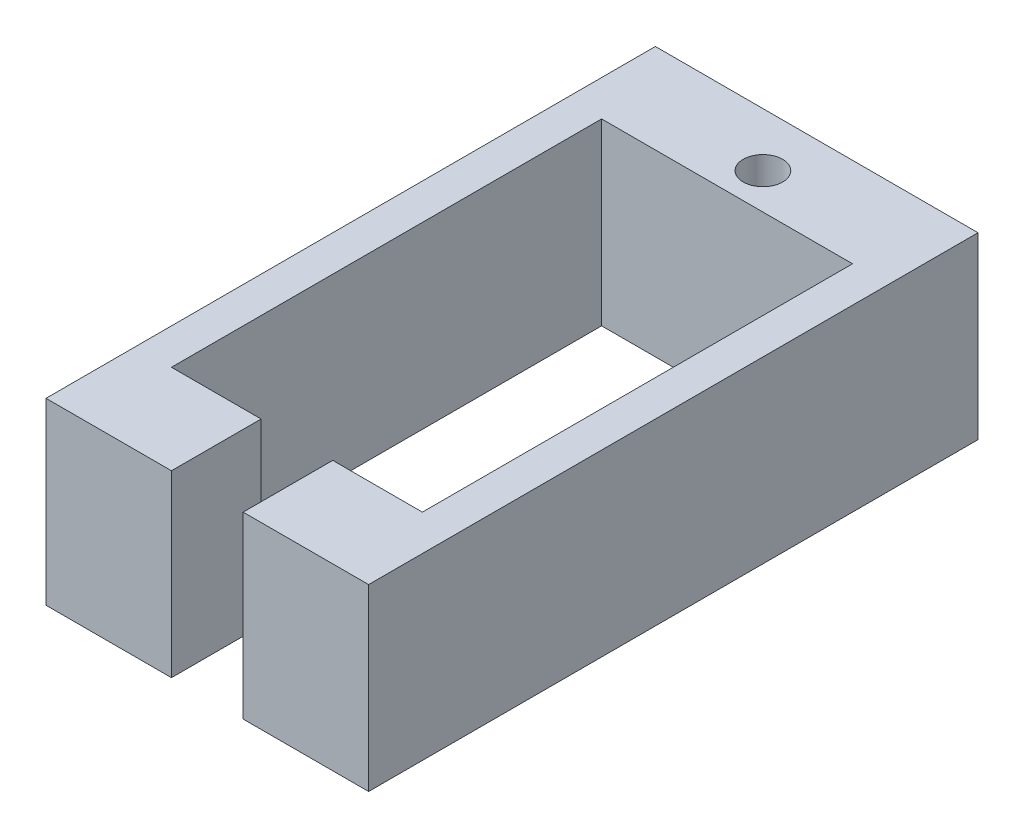
ISO-10303-21;
HEADER;
FILE_DESCRIPTION(('STEP AP214'),'2;1');
FILE_NAME('part.step','',(''),(''),'','','');
FILE_SCHEMA(('AUTOMOTIVE_DESIGN { 1 0 10303 214 1 1 1 1 }'));
ENDSEC;
DATA;
#1=APPLICATION_CONTEXT('core data for automotive mechanical design processes');
#2=APPLICATION_PROTOCOL_DEFINITION('international standard','automotive_design',2000,#1);
#3=PRODUCT_CONTEXT('',#1,'mechanical');
#4=PRODUCT('Part','Part','',(#3));
#5=PRODUCT_RELATED_PRODUCT_CATEGORY('part','',(#4));
#6=PRODUCT_DEFINITION_FORMATION('','',#4);
#7=PRODUCT_DEFINITION_CONTEXT('part definition',#1,'design');
#8=PRODUCT_DEFINITION('design','',#6,#7);
#9=PRODUCT_DEFINITION_SHAPE('','',#8);
#10=(LENGTH_UNIT() NAMED_UNIT(*) SI_UNIT(.MILLI.,.METRE.));
#11=(NAMED_UNIT(*) PLANE_ANGLE_UNIT() SI_UNIT($,.RADIAN.));
#12=(NAMED_UNIT(*) SI_UNIT($,.STERADIAN.) SOLID_ANGLE_UNIT());
#13=UNCERTAINTY_MEASURE_WITH_UNIT(LENGTH_MEASURE(1.E-05),#10,'distance_accuracy_value','');
#14=(GEOMETRIC_REPRESENTATION_CONTEXT(3) GLOBAL_UNCERTAINTY_ASSIGNED_CONTEXT((#13)) GLOBAL_UNIT_ASSIGNED_CONTEXT((#10,
#11,#12)) REPRESENTATION_CONTEXT('',''));
#15=CARTESIAN_POINT('',(0.,0.,0.));
#16=DIRECTION('',(0.,0.,1.));
#17=DIRECTION('',(1.,0.,0.));
#18=AXIS2_PLACEMENT_3D('',#15,#16,#17);
#19=CARTESIAN_POINT('',(-9.,10.,17.));
#20=DIRECTION('',(0.,0.,-1.));
#21=DIRECTION('',(-1.,0.,0.));
#22=AXIS2_PLACEMENT_3D('',#19,#20,#21);
#23=PLANE('',#22);
#24=DIRECTION('',(1.,0.,0.));
#25=VECTOR('',#24,1.);
#26=CARTESIAN_POINT('',(-9.,0.,17.));
#27=LINE('',#26,#25);
#28=CARTESIAN_POINT('',(-9.,0.,17.));
#29=VERTEX_POINT('',#28);
#30=CARTESIAN_POINT('',(-2.,0.,17.));
#31=VERTEX_POINT('',#30);
#32=EDGE_CURVE('E137',#29,#31,#27,.T.);
#33=ORIENTED_EDGE('',*,*,#32,.T.);
#34=DIRECTION('',(0.,-1.,0.));
#35=VECTOR('',#34,1.);
#36=CARTESIAN_POINT('',(-2.,0.,17.));
#37=LINE('',#36,#35);
#38=CARTESIAN_POINT('',(-2.,10.,17.));
#39=VERTEX_POINT('',#38);
#40=EDGE_CURVE('E122',#39,#31,#37,.T.);
#41=ORIENTED_EDGE('',*,*,#40,.F.);
#42=DIRECTION('',(1.,0.,0.));
#43=VECTOR('',#42,1.);
#44=CARTESIAN_POINT('',(-9.,10.,17.));
#45=LINE('',#44,#43);
#46=CARTESIAN_POINT('',(-9.,10.,17.));
#47=VERTEX_POINT('',#46);
#48=EDGE_CURVE('E158',#47,#39,#45,.T.);
#49=ORIENTED_EDGE('',*,*,#48,.F.);
#50=DIRECTION('',(0.,-1.,0.));
#51=VECTOR('',#50,1.);
#52=CARTESIAN_POINT('',(-9.,10.,17.));
#53=LINE('',#52,#51);
#54=EDGE_CURVE('E144',#47,#29,#53,.T.);
#55=ORIENTED_EDGE('',*,*,#54,.T.);
#56=EDGE_LOOP('',(#33,#41,#49,#55));
#57=FACE_BOUND('',#56,.T.);
#58=ADVANCED_FACE('F36',(#57),#23,.F.);
#59=CARTESIAN_POINT('',(-7.,10.,12.));
#60=DIRECTION('',(0.,0.,-1.));
#61=DIRECTION('',(-1.,0.,0.));
#62=AXIS2_PLACEMENT_3D('',#59,#60,#61);
#63=PLANE('',#62);
#64=DIRECTION('',(0.,1.,0.));
#65=VECTOR('',#64,1.);
#66=CARTESIAN_POINT('',(-2.,10.,12.));
#67=LINE('',#66,#65);
#68=CARTESIAN_POINT('',(-2.,0.,12.));
#69=VERTEX_POINT('',#68);
#70=CARTESIAN_POINT('',(-2.,10.,12.));
#71=VERTEX_POINT('',#70);
#72=EDGE_CURVE('E11',#69,#71,#67,.T.);
#73=ORIENTED_EDGE('',*,*,#72,.F.);
#74=DIRECTION('',(1.,0.,0.));
#75=VECTOR('',#74,1.);
#76=CARTESIAN_POINT('',(-7.,0.,12.));
#77=LINE('',#76,#75);
#78=CARTESIAN_POINT('',(-7.,0.,12.));
#79=VERTEX_POINT('',#78);
#80=EDGE_CURVE('E139',#79,#69,#77,.T.);
#81=ORIENTED_EDGE('',*,*,#80,.F.);
#82=DIRECTION('',(0.,-1.,0.));
#83=VECTOR('',#82,1.);
#84=CARTESIAN_POINT('',(-7.,10.,12.));
#85=LINE('',#84,#83);
#86=CARTESIAN_POINT('',(-7.,10.,12.));
#87=VERTEX_POINT('',#86);
#88=EDGE_CURVE('E200',#87,#79,#85,.T.);
#89=ORIENTED_EDGE('',*,*,#88,.F.);
#90=DIRECTION('',(1.,0.,0.));
#91=VECTOR('',#90,1.);
#92=CARTESIAN_POINT('',(-7.,10.,12.));
#93=LINE('',#92,#91);
#94=EDGE_CURVE('E235',#87,#71,#93,.T.);
#95=ORIENTED_EDGE('',*,*,#94,.T.);
#96=EDGE_LOOP('',(#73,#81,#89,#95));
#97=FACE_BOUND('',#96,.T.);
#98=ADVANCED_FACE('F255',(#97),#63,.T.);
#99=CARTESIAN_POINT('',(0.,10.,0.));
#100=DIRECTION('',(0.,1.,0.));
#101=DIRECTION('',(0.,0.,1.));
#102=AXIS2_PLACEMENT_3D('',#99,#100,#101);
#103=PLANE('',#102);
#104=DIRECTION('',(0.,0.,1.));
#105=VECTOR('',#104,1.);
#106=CARTESIAN_POINT('',(-2.,10.,7.));
#107=LINE('',#106,#105);
#108=EDGE_CURVE('E125',#71,#39,#107,.T.);
#109=ORIENTED_EDGE('',*,*,#108,.F.);
#110=ORIENTED_EDGE('',*,*,#94,.F.);
#111=DIRECTION('',(0.,0.,1.));
#112=VECTOR('',#111,1.);
#113=CARTESIAN_POINT('',(-7.,10.,-12.));
#114=LINE('',#113,#112);
#115=CARTESIAN_POINT('',(-7.,10.,-12.));
#116=VERTEX_POINT('',#115);
#117=EDGE_CURVE('E192',#116,#87,#114,.T.);
#118=ORIENTED_EDGE('',*,*,#117,.F.);
#119=DIRECTION('',(-1.,0.,0.));
#120=VECTOR('',#119,1.);
#121=CARTESIAN_POINT('',(-7.,10.,-12.));
#122=LINE('',#121,#120);
#123=CARTESIAN_POINT('',(7.,10.,-12.));
#124=VERTEX_POINT('',#123);
#125=EDGE_CURVE('E197',#124,#116,#122,.T.);
#126=ORIENTED_EDGE('',*,*,#125,.F.);
#127=DIRECTION('',(0.,0.,-1.));
#128=VECTOR('',#127,1.);
#129=CARTESIAN_POINT('',(7.,10.,-12.));
#130=LINE('',#129,#128);
#131=CARTESIAN_POINT('',(7.,10.,12.));
#132=VERTEX_POINT('',#131);
#133=EDGE_CURVE('E238',#132,#124,#130,.T.);
#134=ORIENTED_EDGE('',*,*,#133,.F.);
#135=CARTESIAN_POINT('',(2.,10.,12.));
#136=VERTEX_POINT('',#135);
#137=EDGE_CURVE('E234',#136,#132,#93,.T.);
#138=ORIENTED_EDGE('',*,*,#137,.F.);
#139=DIRECTION('',(0.,0.,1.));
#140=VECTOR('',#139,1.);
#141=CARTESIAN_POINT('',(2.,10.,7.));
#142=LINE('',#141,#140);
#143=CARTESIAN_POINT('',(2.,10.,17.));
#144=VERTEX_POINT('',#143);
#145=EDGE_CURVE('E51',#136,#144,#142,.T.);
#146=ORIENTED_EDGE('',*,*,#145,.T.);
#147=CARTESIAN_POINT('',(9.,10.,17.));
#148=VERTEX_POINT('',#147);
#149=EDGE_CURVE('E207',#144,#148,#45,.T.);
#150=ORIENTED_EDGE('',*,*,#149,.T.);
#151=DIRECTION('',(0.,0.,-1.));
#152=VECTOR('',#151,1.);
#153=CARTESIAN_POINT('',(9.,10.,-17.));
#154=LINE('',#153,#152);
#155=CARTESIAN_POINT('',(9.,10.,-17.));
#156=VERTEX_POINT('',#155);
#157=EDGE_CURVE('E145',#148,#156,#154,.T.);
#158=ORIENTED_EDGE('',*,*,#157,.T.);
#159=DIRECTION('',(-1.,0.,0.));
#160=VECTOR('',#159,1.);
#161=CARTESIAN_POINT('',(-9.,10.,-17.));
#162=LINE('',#161,#160);
#163=CARTESIAN_POINT('',(-9.,10.,-17.));
#164=VERTEX_POINT('',#163);
#165=EDGE_CURVE('E149',#156,#164,#162,.T.);
#166=ORIENTED_EDGE('',*,*,#165,.T.);
#167=DIRECTION('',(0.,0.,1.));
#168=VECTOR('',#167,1.);
#169=CARTESIAN_POINT('',(-9.,10.,-17.));
#170=LINE('',#169,#168);
#171=EDGE_CURVE('E205',#164,#47,#170,.T.);
#172=ORIENTED_EDGE('',*,*,#171,.T.);
#173=ORIENTED_EDGE('',*,*,#48,.T.);
#174=EDGE_LOOP('',(#109,#110,#118,#126,#134,#138,#146,#150,#158,#166,#172,#173));
#175=FACE_BOUND('',#174,.T.);
#176=CARTESIAN_POINT('',(0.,10.,-14.));
#177=DIRECTION('',(0.,-1.,0.));
#178=DIRECTION('',(0.,0.,1.));
#179=AXIS2_PLACEMENT_3D('',#176,#177,#178);
#180=CIRCLE('',#179,1.1);
#181=CARTESIAN_POINT('',(0.,10.,-12.9));
#182=VERTEX_POINT('',#181);
#183=EDGE_CURVE('E184',#182,#182,#180,.T.);
#184=ORIENTED_EDGE('',*,*,#183,.T.);
#185=EDGE_LOOP('',(#184));
#186=FACE_BOUND('',#185,.T.);
#187=ADVANCED_FACE('F252',(#175,#186),#103,.T.);
#188=CARTESIAN_POINT('',(0.,0.,0.));
#189=DIRECTION('',(0.,1.,0.));
#190=DIRECTION('',(0.,0.,1.));
#191=AXIS2_PLACEMENT_3D('',#188,#189,#190);
#192=PLANE('',#191);
#193=CARTESIAN_POINT('',(0.,0.,-14.));
#194=DIRECTION('',(0.,-1.,0.));
#195=DIRECTION('',(0.,0.,1.));
#196=AXIS2_PLACEMENT_3D('',#193,#194,#195);
#197=CIRCLE('',#196,1.1);
#198=CARTESIAN_POINT('',(0.,0.,-12.9));
#199=VERTEX_POINT('',#198);
#200=EDGE_CURVE('E227',#199,#199,#197,.T.);
#201=ORIENTED_EDGE('',*,*,#200,.F.);
#202=EDGE_LOOP('',(#201));
#203=FACE_BOUND('',#202,.T.);
#204=ORIENTED_EDGE('',*,*,#80,.T.);
#205=DIRECTION('',(0.,0.,1.));
#206=VECTOR('',#205,1.);
#207=CARTESIAN_POINT('',(-2.,0.,7.));
#208=LINE('',#207,#206);
#209=EDGE_CURVE('E58',#69,#31,#208,.T.);
#210=ORIENTED_EDGE('',*,*,#209,.T.);
#211=ORIENTED_EDGE('',*,*,#32,.F.);
#212=DIRECTION('',(0.,0.,1.));
#213=VECTOR('',#212,1.);
#214=CARTESIAN_POINT('',(-9.,0.,-17.));
#215=LINE('',#214,#213);
#216=CARTESIAN_POINT('',(-9.,0.,-17.));
#217=VERTEX_POINT('',#216);
#218=EDGE_CURVE('E151',#217,#29,#215,.T.);
#219=ORIENTED_EDGE('',*,*,#218,.F.);
#220=DIRECTION('',(-1.,0.,0.));
#221=VECTOR('',#220,1.);
#222=CARTESIAN_POINT('',(-9.,0.,-17.));
#223=LINE('',#222,#221);
#224=CARTESIAN_POINT('',(9.,0.,-17.));
#225=VERTEX_POINT('',#224);
#226=EDGE_CURVE('E210',#225,#217,#223,.T.);
#227=ORIENTED_EDGE('',*,*,#226,.F.);
#228=DIRECTION('',(0.,0.,-1.));
#229=VECTOR('',#228,1.);
#230=CARTESIAN_POINT('',(9.,0.,-17.));
#231=LINE('',#230,#229);
#232=CARTESIAN_POINT('',(9.,0.,17.));
#233=VERTEX_POINT('',#232);
#234=EDGE_CURVE('E202',#233,#225,#231,.T.);
#235=ORIENTED_EDGE('',*,*,#234,.F.);
#236=CARTESIAN_POINT('',(2.,0.,17.));
#237=VERTEX_POINT('',#236);
#238=EDGE_CURVE('E146',#237,#233,#27,.T.);
#239=ORIENTED_EDGE('',*,*,#238,.F.);
#240=DIRECTION('',(0.,0.,1.));
#241=VECTOR('',#240,1.);
#242=CARTESIAN_POINT('',(2.,0.,7.));
#243=LINE('',#242,#241);
#244=CARTESIAN_POINT('',(2.,0.,12.));
#245=VERTEX_POINT('',#244);
#246=EDGE_CURVE('E140',#245,#237,#243,.T.);
#247=ORIENTED_EDGE('',*,*,#246,.F.);
#248=CARTESIAN_POINT('',(7.,0.,12.));
#249=VERTEX_POINT('',#248);
#250=EDGE_CURVE('E173',#245,#249,#77,.T.);
#251=ORIENTED_EDGE('',*,*,#250,.T.);
#252=DIRECTION('',(0.,0.,-1.));
#253=VECTOR('',#252,1.);
#254=CARTESIAN_POINT('',(7.,0.,-12.));
#255=LINE('',#254,#253);
#256=CARTESIAN_POINT('',(7.,0.,-12.));
#257=VERTEX_POINT('',#256);
#258=EDGE_CURVE('E183',#249,#257,#255,.T.);
#259=ORIENTED_EDGE('',*,*,#258,.T.);
#260=DIRECTION('',(-1.,0.,0.));
#261=VECTOR('',#260,1.);
#262=CARTESIAN_POINT('',(-7.,0.,-12.));
#263=LINE('',#262,#261);
#264=CARTESIAN_POINT('',(-7.,0.,-12.));
#265=VERTEX_POINT('',#264);
#266=EDGE_CURVE('E189',#257,#265,#263,.T.);
#267=ORIENTED_EDGE('',*,*,#266,.T.);
#268=DIRECTION('',(0.,0.,1.));
#269=VECTOR('',#268,1.);
#270=CARTESIAN_POINT('',(-7.,0.,-12.));
#271=LINE('',#270,#269);
#272=EDGE_CURVE('E181',#265,#79,#271,.T.);
#273=ORIENTED_EDGE('',*,*,#272,.T.);
#274=EDGE_LOOP('',(#204,#210,#211,#219,#227,#235,#239,#247,#251,#259,#267,#273));
#275=FACE_BOUND('',#274,.T.);
#276=ADVANCED_FACE('F135',(#203,#275),#192,.F.);
#277=CARTESIAN_POINT('',(9.,10.,-17.));
#278=DIRECTION('',(-1.,0.,0.));
#279=DIRECTION('',(0.,0.,1.));
#280=AXIS2_PLACEMENT_3D('',#277,#278,#279);
#281=PLANE('',#280);
#282=ORIENTED_EDGE('',*,*,#234,.T.);
#283=DIRECTION('',(0.,-1.,0.));
#284=VECTOR('',#283,1.);
#285=CARTESIAN_POINT('',(9.,10.,-17.));
#286=LINE('',#285,#284);
#287=EDGE_CURVE('E163',#156,#225,#286,.T.);
#288=ORIENTED_EDGE('',*,*,#287,.F.);
#289=ORIENTED_EDGE('',*,*,#157,.F.);
#290=DIRECTION('',(0.,-1.,0.));
#291=VECTOR('',#290,1.);
#292=CARTESIAN_POINT('',(9.,10.,17.));
#293=LINE('',#292,#291);
#294=EDGE_CURVE('E155',#148,#233,#293,.T.);
#295=ORIENTED_EDGE('',*,*,#294,.T.);
#296=EDGE_LOOP('',(#282,#288,#289,#295));
#297=FACE_BOUND('',#296,.T.);
#298=ADVANCED_FACE('F38',(#297),#281,.F.);
#299=CARTESIAN_POINT('',(-9.,10.,-17.));
#300=DIRECTION('',(0.,0.,1.));
#301=DIRECTION('',(1.,0.,0.));
#302=AXIS2_PLACEMENT_3D('',#299,#300,#301);
#303=PLANE('',#302);
#304=ORIENTED_EDGE('',*,*,#226,.T.);
#305=DIRECTION('',(0.,-1.,0.));
#306=VECTOR('',#305,1.);
#307=CARTESIAN_POINT('',(-9.,10.,-17.));
#308=LINE('',#307,#306);
#309=EDGE_CURVE('E160',#164,#217,#308,.T.);
#310=ORIENTED_EDGE('',*,*,#309,.F.);
#311=ORIENTED_EDGE('',*,*,#165,.F.);
#312=ORIENTED_EDGE('',*,*,#287,.T.);
#313=EDGE_LOOP('',(#304,#310,#311,#312));
#314=FACE_BOUND('',#313,.T.);
#315=ADVANCED_FACE('F217',(#314),#303,.F.);
#316=CARTESIAN_POINT('',(-9.,10.,-17.));
#317=DIRECTION('',(1.,0.,0.));
#318=DIRECTION('',(0.,0.,-1.));
#319=AXIS2_PLACEMENT_3D('',#316,#317,#318);
#320=PLANE('',#319);
#321=ORIENTED_EDGE('',*,*,#218,.T.);
#322=ORIENTED_EDGE('',*,*,#54,.F.);
#323=ORIENTED_EDGE('',*,*,#171,.F.);
#324=ORIENTED_EDGE('',*,*,#309,.T.);
#325=EDGE_LOOP('',(#321,#322,#323,#324));
#326=FACE_BOUND('',#325,.T.);
#327=ADVANCED_FACE('F214',(#326),#320,.F.);
#328=ORIENTED_EDGE('',*,*,#149,.F.);
#329=DIRECTION('',(0.,1.,0.));
#330=VECTOR('',#329,1.);
#331=CARTESIAN_POINT('',(2.,0.,17.));
#332=LINE('',#331,#330);
#333=EDGE_CURVE('E130',#237,#144,#332,.T.);
#334=ORIENTED_EDGE('',*,*,#333,.F.);
#335=ORIENTED_EDGE('',*,*,#238,.T.);
#336=ORIENTED_EDGE('',*,*,#294,.F.);
#337=EDGE_LOOP('',(#328,#334,#335,#336));
#338=FACE_BOUND('',#337,.T.);
#339=ADVANCED_FACE('F223',(#338),#23,.F.);
#340=CARTESIAN_POINT('',(-7.,10.,-12.));
#341=DIRECTION('',(1.,0.,0.));
#342=DIRECTION('',(0.,0.,-1.));
#343=AXIS2_PLACEMENT_3D('',#340,#341,#342);
#344=PLANE('',#343);
#345=ORIENTED_EDGE('',*,*,#272,.F.);
#346=DIRECTION('',(0.,-1.,0.));
#347=VECTOR('',#346,1.);
#348=CARTESIAN_POINT('',(-7.,10.,-12.));
#349=LINE('',#348,#347);
#350=EDGE_CURVE('E193',#116,#265,#349,.T.);
#351=ORIENTED_EDGE('',*,*,#350,.F.);
#352=ORIENTED_EDGE('',*,*,#117,.T.);
#353=ORIENTED_EDGE('',*,*,#88,.T.);
#354=EDGE_LOOP('',(#345,#351,#352,#353));
#355=FACE_BOUND('',#354,.T.);
#356=ADVANCED_FACE('F249',(#355),#344,.T.);
#357=DIRECTION('',(0.,-1.,0.));
#358=VECTOR('',#357,1.);
#359=CARTESIAN_POINT('',(2.,10.,12.));
#360=LINE('',#359,#358);
#361=EDGE_CURVE('E44',#136,#245,#360,.T.);
#362=ORIENTED_EDGE('',*,*,#361,.F.);
#363=ORIENTED_EDGE('',*,*,#137,.T.);
#364=DIRECTION('',(0.,-1.,0.));
#365=VECTOR('',#364,1.);
#366=CARTESIAN_POINT('',(7.,10.,12.));
#367=LINE('',#366,#365);
#368=EDGE_CURVE('E179',#132,#249,#367,.T.);
#369=ORIENTED_EDGE('',*,*,#368,.T.);
#370=ORIENTED_EDGE('',*,*,#250,.F.);
#371=EDGE_LOOP('',(#362,#363,#369,#370));
#372=FACE_BOUND('',#371,.T.);
#373=ADVANCED_FACE('F177',(#372),#63,.T.);
#374=CARTESIAN_POINT('',(7.,10.,-12.));
#375=DIRECTION('',(-1.,0.,0.));
#376=DIRECTION('',(0.,0.,1.));
#377=AXIS2_PLACEMENT_3D('',#374,#375,#376);
#378=PLANE('',#377);
#379=ORIENTED_EDGE('',*,*,#258,.F.);
#380=ORIENTED_EDGE('',*,*,#368,.F.);
#381=ORIENTED_EDGE('',*,*,#133,.T.);
#382=DIRECTION('',(0.,-1.,0.));
#383=VECTOR('',#382,1.);
#384=CARTESIAN_POINT('',(7.,10.,-12.));
#385=LINE('',#384,#383);
#386=EDGE_CURVE('E196',#124,#257,#385,.T.);
#387=ORIENTED_EDGE('',*,*,#386,.T.);
#388=EDGE_LOOP('',(#379,#380,#381,#387));
#389=FACE_BOUND('',#388,.T.);
#390=ADVANCED_FACE('F257',(#389),#378,.T.);
#391=CARTESIAN_POINT('',(-7.,10.,-12.));
#392=DIRECTION('',(0.,0.,1.));
#393=DIRECTION('',(1.,0.,0.));
#394=AXIS2_PLACEMENT_3D('',#391,#392,#393);
#395=PLANE('',#394);
#396=ORIENTED_EDGE('',*,*,#266,.F.);
#397=ORIENTED_EDGE('',*,*,#386,.F.);
#398=ORIENTED_EDGE('',*,*,#125,.T.);
#399=ORIENTED_EDGE('',*,*,#350,.T.);
#400=EDGE_LOOP('',(#396,#397,#398,#399));
#401=FACE_BOUND('',#400,.T.);
#402=ADVANCED_FACE('F244',(#401),#395,.T.);
#403=CARTESIAN_POINT('',(0.,10.,-14.));
#404=DIRECTION('',(0.,-1.,0.));
#405=DIRECTION('',(0.,0.,-1.));
#406=AXIS2_PLACEMENT_3D('',#403,#404,#405);
#407=CYLINDRICAL_SURFACE('',#406,1.1);
#408=ORIENTED_EDGE('',*,*,#183,.F.);
#409=EDGE_LOOP('',(#408));
#410=FACE_BOUND('',#409,.T.);
#411=ORIENTED_EDGE('',*,*,#200,.T.);
#412=EDGE_LOOP('',(#411));
#413=FACE_BOUND('',#412,.T.);
#414=ADVANCED_FACE('F264',(#410,#413),#407,.F.);
#415=CARTESIAN_POINT('',(2.,0.,7.));
#416=DIRECTION('',(1.,0.,0.));
#417=DIRECTION('',(0.,0.,-1.));
#418=AXIS2_PLACEMENT_3D('',#415,#416,#417);
#419=PLANE('',#418);
#420=ORIENTED_EDGE('',*,*,#361,.T.);
#421=ORIENTED_EDGE('',*,*,#246,.T.);
#422=ORIENTED_EDGE('',*,*,#333,.T.);
#423=ORIENTED_EDGE('',*,*,#145,.F.);
#424=EDGE_LOOP('',(#420,#421,#422,#423));
#425=FACE_BOUND('',#424,.T.);
#426=ADVANCED_FACE('F166',(#425),#419,.F.);
#427=CARTESIAN_POINT('',(-2.,0.,7.));
#428=DIRECTION('',(-1.,0.,0.));
#429=DIRECTION('',(0.,0.,1.));
#430=AXIS2_PLACEMENT_3D('',#427,#428,#429);
#431=PLANE('',#430);
#432=ORIENTED_EDGE('',*,*,#72,.T.);
#433=ORIENTED_EDGE('',*,*,#108,.T.);
#434=ORIENTED_EDGE('',*,*,#40,.T.);
#435=ORIENTED_EDGE('',*,*,#209,.F.);
#436=EDGE_LOOP('',(#432,#433,#434,#435));
#437=FACE_BOUND('',#436,.T.);
#438=ADVANCED_FACE('F123',(#437),#431,.F.);
#439=CLOSED_SHELL('',(#58,#98,#187,#276,#298,#315,#327,#339,#356,#373,#390,#402,#414,#426,#438));
#440=MANIFOLD_SOLID_BREP('B2',#439);
#441=ADVANCED_BREP_SHAPE_REPRESENTATION('',(#18,#440),#14);
#442=SHAPE_DEFINITION_REPRESENTATION(#9,#441);
ENDSEC;
END-ISO-10303-21;
